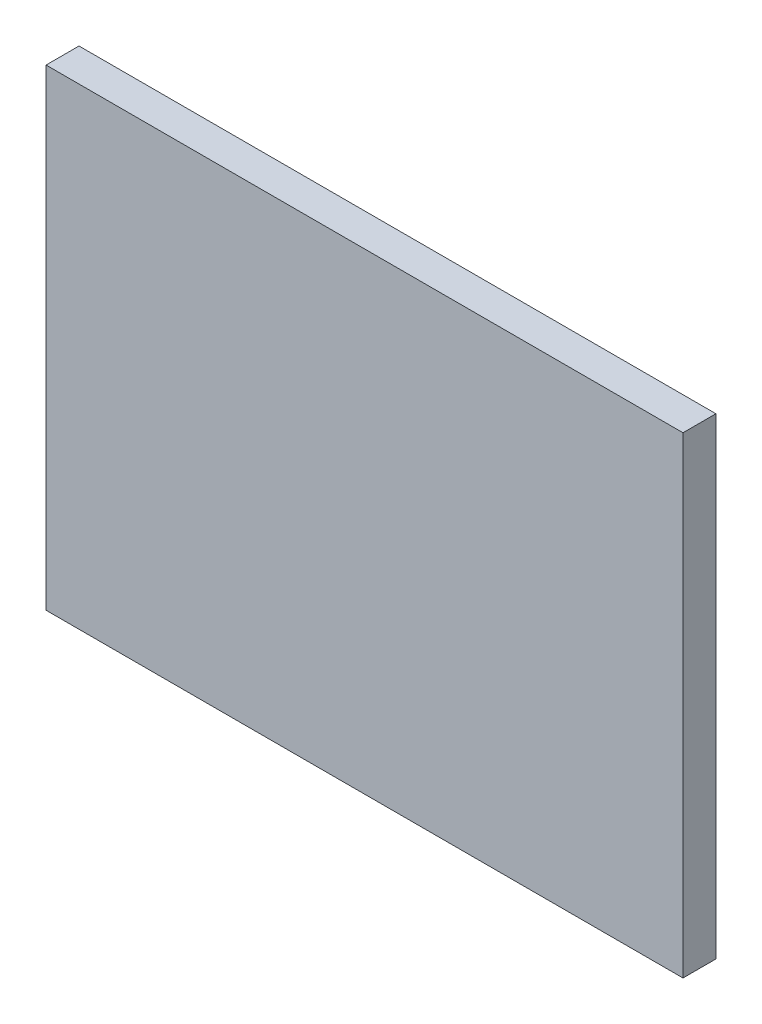
ISO-10303-21;
HEADER;
FILE_DESCRIPTION(('STEP AP214'),'2;1');
FILE_NAME('part.step','',(''),(''),'','','');
FILE_SCHEMA(('AUTOMOTIVE_DESIGN { 1 0 10303 214 1 1 1 1 }'));
ENDSEC;
DATA;
#1=APPLICATION_CONTEXT('core data for automotive mechanical design processes');
#2=APPLICATION_PROTOCOL_DEFINITION('international standard','automotive_design',2000,#1);
#3=PRODUCT_CONTEXT('',#1,'mechanical');
#4=PRODUCT('Part','Part','',(#3));
#5=PRODUCT_RELATED_PRODUCT_CATEGORY('part','',(#4));
#6=PRODUCT_DEFINITION_FORMATION('','',#4);
#7=PRODUCT_DEFINITION_CONTEXT('part definition',#1,'design');
#8=PRODUCT_DEFINITION('design','',#6,#7);
#9=PRODUCT_DEFINITION_SHAPE('','',#8);
#10=(LENGTH_UNIT() NAMED_UNIT(*) SI_UNIT(.MILLI.,.METRE.));
#11=(NAMED_UNIT(*) PLANE_ANGLE_UNIT() SI_UNIT($,.RADIAN.));
#12=(NAMED_UNIT(*) SI_UNIT($,.STERADIAN.) SOLID_ANGLE_UNIT());
#13=UNCERTAINTY_MEASURE_WITH_UNIT(LENGTH_MEASURE(1.E-05),#10,'distance_accuracy_value','');
#14=(GEOMETRIC_REPRESENTATION_CONTEXT(3) GLOBAL_UNCERTAINTY_ASSIGNED_CONTEXT((#13)) GLOBAL_UNIT_ASSIGNED_CONTEXT((#10,
#11,#12)) REPRESENTATION_CONTEXT('',''));
#15=CARTESIAN_POINT('',(0.,0.,0.));
#16=DIRECTION('',(0.,0.,1.));
#17=DIRECTION('',(1.,0.,0.));
#18=AXIS2_PLACEMENT_3D('',#15,#16,#17);
#19=CARTESIAN_POINT('',(10.0289924442334,22.5516874147439,3.));
#20=DIRECTION('',(1.,0.,0.));
#21=DIRECTION('',(0.,1.,0.));
#22=AXIS2_PLACEMENT_3D('',#19,#20,#21);
#23=PLANE('',#22);
#24=DIRECTION('',(0.,-1.,0.));
#25=VECTOR('',#24,1.);
#26=CARTESIAN_POINT('',(10.0289924442334,22.5516874147439,0.));
#27=LINE('',#26,#25);
#28=CARTESIAN_POINT('',(10.0289924442334,22.5516874147439,0.));
#29=VERTEX_POINT('',#28);
#30=CARTESIAN_POINT('',(10.0289924442334,-20.4483125852561,0.));
#31=VERTEX_POINT('',#30);
#32=EDGE_CURVE('E111',#29,#31,#27,.T.);
#33=ORIENTED_EDGE('',*,*,#32,.F.);
#34=DIRECTION('',(0.,0.,-1.));
#35=VECTOR('',#34,1.);
#36=CARTESIAN_POINT('',(10.0289924442334,22.5516874147439,3.));
#37=LINE('',#36,#35);
#38=CARTESIAN_POINT('',(10.0289924442334,22.5516874147439,3.));
#39=VERTEX_POINT('',#38);
#40=EDGE_CURVE('E11',#39,#29,#37,.T.);
#41=ORIENTED_EDGE('',*,*,#40,.F.);
#42=DIRECTION('',(0.,-1.,0.));
#43=VECTOR('',#42,1.);
#44=CARTESIAN_POINT('',(10.0289924442334,22.5516874147439,3.));
#45=LINE('',#44,#43);
#46=CARTESIAN_POINT('',(10.0289924442334,-20.4483125852561,3.));
#47=VERTEX_POINT('',#46);
#48=EDGE_CURVE('E103',#39,#47,#45,.T.);
#49=ORIENTED_EDGE('',*,*,#48,.T.);
#50=DIRECTION('',(0.,0.,-1.));
#51=VECTOR('',#50,1.);
#52=CARTESIAN_POINT('',(10.0289924442334,-20.4483125852561,3.));
#53=LINE('',#52,#51);
#54=EDGE_CURVE('E44',#47,#31,#53,.T.);
#55=ORIENTED_EDGE('',*,*,#54,.T.);
#56=EDGE_LOOP('',(#33,#41,#49,#55));
#57=FACE_BOUND('',#56,.T.);
#58=ADVANCED_FACE('F41',(#57),#23,.T.);
#59=CARTESIAN_POINT('',(-47.9710075557666,22.5516874147439,3.));
#60=DIRECTION('',(0.,1.,0.));
#61=DIRECTION('',(0.,0.,1.));
#62=AXIS2_PLACEMENT_3D('',#59,#60,#61);
#63=PLANE('',#62);
#64=DIRECTION('',(1.,0.,0.));
#65=VECTOR('',#64,1.);
#66=CARTESIAN_POINT('',(-47.9710075557666,22.5516874147439,0.));
#67=LINE('',#66,#65);
#68=CARTESIAN_POINT('',(-47.9710075557666,22.5516874147439,0.));
#69=VERTEX_POINT('',#68);
#70=EDGE_CURVE('E106',#69,#29,#67,.T.);
#71=ORIENTED_EDGE('',*,*,#70,.F.);
#72=DIRECTION('',(0.,0.,-1.));
#73=VECTOR('',#72,1.);
#74=CARTESIAN_POINT('',(-47.9710075557666,22.5516874147439,3.));
#75=LINE('',#74,#73);
#76=CARTESIAN_POINT('',(-47.9710075557666,22.5516874147439,3.));
#77=VERTEX_POINT('',#76);
#78=EDGE_CURVE('E51',#77,#69,#75,.T.);
#79=ORIENTED_EDGE('',*,*,#78,.F.);
#80=DIRECTION('',(1.,0.,0.));
#81=VECTOR('',#80,1.);
#82=CARTESIAN_POINT('',(-47.9710075557666,22.5516874147439,3.));
#83=LINE('',#82,#81);
#84=EDGE_CURVE('E98',#77,#39,#83,.T.);
#85=ORIENTED_EDGE('',*,*,#84,.T.);
#86=ORIENTED_EDGE('',*,*,#40,.T.);
#87=EDGE_LOOP('',(#71,#79,#85,#86));
#88=FACE_BOUND('',#87,.T.);
#89=ADVANCED_FACE('F127',(#88),#63,.T.);
#90=CARTESIAN_POINT('',(-47.9710075557666,-20.4483125852561,3.));
#91=DIRECTION('',(-1.,0.,0.));
#92=DIRECTION('',(0.,0.,1.));
#93=AXIS2_PLACEMENT_3D('',#90,#91,#92);
#94=PLANE('',#93);
#95=DIRECTION('',(0.,1.,0.));
#96=VECTOR('',#95,1.);
#97=CARTESIAN_POINT('',(-47.9710075557666,-20.4483125852561,0.));
#98=LINE('',#97,#96);
#99=CARTESIAN_POINT('',(-47.9710075557666,-20.4483125852561,0.));
#100=VERTEX_POINT('',#99);
#101=EDGE_CURVE('E92',#100,#69,#98,.T.);
#102=ORIENTED_EDGE('',*,*,#101,.F.);
#103=DIRECTION('',(0.,0.,-1.));
#104=VECTOR('',#103,1.);
#105=CARTESIAN_POINT('',(-47.9710075557666,-20.4483125852561,3.));
#106=LINE('',#105,#104);
#107=CARTESIAN_POINT('',(-47.9710075557666,-20.4483125852561,3.));
#108=VERTEX_POINT('',#107);
#109=EDGE_CURVE('E87',#108,#100,#106,.T.);
#110=ORIENTED_EDGE('',*,*,#109,.F.);
#111=DIRECTION('',(0.,1.,0.));
#112=VECTOR('',#111,1.);
#113=CARTESIAN_POINT('',(-47.9710075557666,-20.4483125852561,3.));
#114=LINE('',#113,#112);
#115=EDGE_CURVE('E90',#108,#77,#114,.T.);
#116=ORIENTED_EDGE('',*,*,#115,.T.);
#117=ORIENTED_EDGE('',*,*,#78,.T.);
#118=EDGE_LOOP('',(#102,#110,#116,#117));
#119=FACE_BOUND('',#118,.T.);
#120=ADVANCED_FACE('F89',(#119),#94,.T.);
#121=CARTESIAN_POINT('',(10.0289924442334,-20.4483125852561,3.));
#122=DIRECTION('',(0.,-1.,0.));
#123=DIRECTION('',(0.,0.,-1.));
#124=AXIS2_PLACEMENT_3D('',#121,#122,#123);
#125=PLANE('',#124);
#126=DIRECTION('',(-1.,0.,0.));
#127=VECTOR('',#126,1.);
#128=CARTESIAN_POINT('',(10.0289924442334,-20.4483125852561,0.));
#129=LINE('',#128,#127);
#130=EDGE_CURVE('E115',#31,#100,#129,.T.);
#131=ORIENTED_EDGE('',*,*,#130,.F.);
#132=ORIENTED_EDGE('',*,*,#54,.F.);
#133=DIRECTION('',(-1.,0.,0.));
#134=VECTOR('',#133,1.);
#135=CARTESIAN_POINT('',(10.0289924442334,-20.4483125852561,3.));
#136=LINE('',#135,#134);
#137=EDGE_CURVE('E97',#47,#108,#136,.T.);
#138=ORIENTED_EDGE('',*,*,#137,.T.);
#139=ORIENTED_EDGE('',*,*,#109,.T.);
#140=EDGE_LOOP('',(#131,#132,#138,#139));
#141=FACE_BOUND('',#140,.T.);
#142=ADVANCED_FACE('F101',(#141),#125,.T.);
#143=CARTESIAN_POINT('',(0.,0.,3.));
#144=DIRECTION('',(0.,0.,-1.));
#145=DIRECTION('',(-1.,0.,0.));
#146=AXIS2_PLACEMENT_3D('',#143,#144,#145);
#147=PLANE('',#146);
#148=ORIENTED_EDGE('',*,*,#48,.F.);
#149=ORIENTED_EDGE('',*,*,#84,.F.);
#150=ORIENTED_EDGE('',*,*,#115,.F.);
#151=ORIENTED_EDGE('',*,*,#137,.F.);
#152=EDGE_LOOP('',(#148,#149,#150,#151));
#153=FACE_BOUND('',#152,.T.);
#154=ADVANCED_FACE('F96',(#153),#147,.F.);
#155=CARTESIAN_POINT('',(0.,0.,0.));
#156=DIRECTION('',(0.,0.,-1.));
#157=DIRECTION('',(-1.,0.,0.));
#158=AXIS2_PLACEMENT_3D('',#155,#156,#157);
#159=PLANE('',#158);
#160=ORIENTED_EDGE('',*,*,#32,.T.);
#161=ORIENTED_EDGE('',*,*,#130,.T.);
#162=ORIENTED_EDGE('',*,*,#101,.T.);
#163=ORIENTED_EDGE('',*,*,#70,.T.);
#164=EDGE_LOOP('',(#160,#161,#162,#163));
#165=FACE_BOUND('',#164,.T.);
#166=ADVANCED_FACE('F126',(#165),#159,.T.);
#167=CLOSED_SHELL('',(#58,#89,#120,#142,#154,#166));
#168=MANIFOLD_SOLID_BREP('B2',#167);
#169=ADVANCED_BREP_SHAPE_REPRESENTATION('',(#18,#168),#14);
#170=SHAPE_DEFINITION_REPRESENTATION(#9,#169);
ENDSEC;
END-ISO-10303-21;
